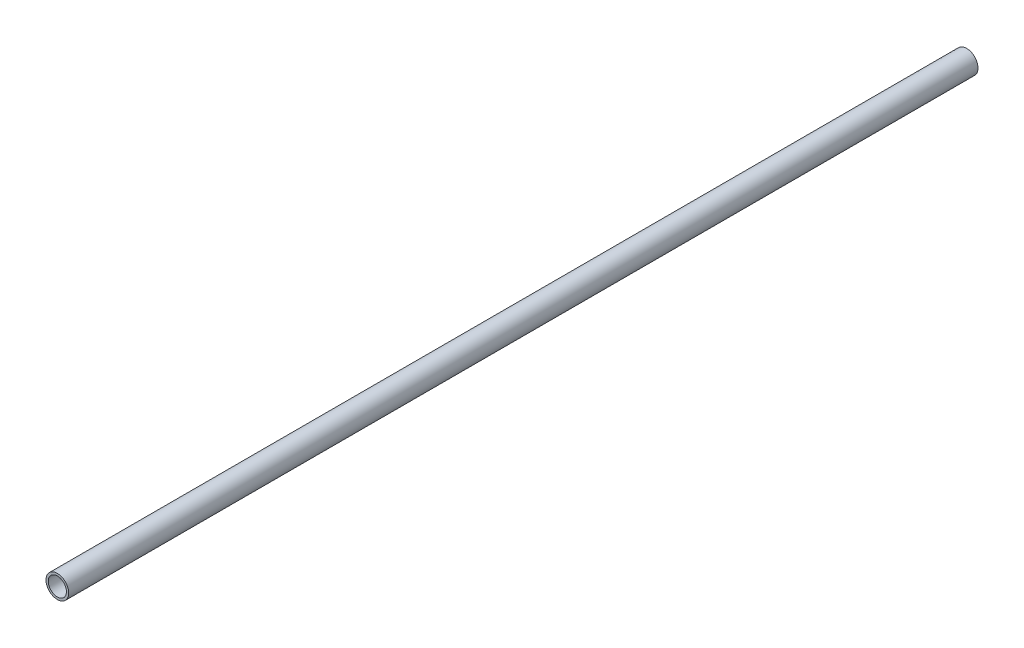
ISO-10303-21;
HEADER;
FILE_DESCRIPTION(('STEP AP214'),'2;1');
FILE_NAME('part.step','',(''),(''),'','','');
FILE_SCHEMA(('AUTOMOTIVE_DESIGN { 1 0 10303 214 1 1 1 1 }'));
ENDSEC;
DATA;
#1=APPLICATION_CONTEXT('core data for automotive mechanical design processes');
#2=APPLICATION_PROTOCOL_DEFINITION('international standard','automotive_design',2000,#1);
#3=PRODUCT_CONTEXT('',#1,'mechanical');
#4=PRODUCT('Part','Part','',(#3));
#5=PRODUCT_RELATED_PRODUCT_CATEGORY('part','',(#4));
#6=PRODUCT_DEFINITION_FORMATION('','',#4);
#7=PRODUCT_DEFINITION_CONTEXT('part definition',#1,'design');
#8=PRODUCT_DEFINITION('design','',#6,#7);
#9=PRODUCT_DEFINITION_SHAPE('','',#8);
#10=(LENGTH_UNIT() NAMED_UNIT(*) SI_UNIT(.MILLI.,.METRE.));
#11=(NAMED_UNIT(*) PLANE_ANGLE_UNIT() SI_UNIT($,.RADIAN.));
#12=(NAMED_UNIT(*) SI_UNIT($,.STERADIAN.) SOLID_ANGLE_UNIT());
#13=UNCERTAINTY_MEASURE_WITH_UNIT(LENGTH_MEASURE(1.E-05),#10,'distance_accuracy_value','');
#14=(GEOMETRIC_REPRESENTATION_CONTEXT(3) GLOBAL_UNCERTAINTY_ASSIGNED_CONTEXT((#13)) GLOBAL_UNIT_ASSIGNED_CONTEXT((#10,
#11,#12)) REPRESENTATION_CONTEXT('',''));
#15=CARTESIAN_POINT('',(0.,0.,0.));
#16=DIRECTION('',(0.,0.,1.));
#17=DIRECTION('',(1.,0.,0.));
#18=AXIS2_PLACEMENT_3D('',#15,#16,#17);
#19=CARTESIAN_POINT('',(0.,0.,400.));
#20=DIRECTION('',(0.,0.,1.));
#21=DIRECTION('',(1.,0.,0.));
#22=AXIS2_PLACEMENT_3D('',#19,#20,#21);
#23=PLANE('',#22);
#24=CARTESIAN_POINT('',(0.,0.,400.));
#25=DIRECTION('',(0.,0.,1.));
#26=DIRECTION('',(1.,0.,0.));
#27=AXIS2_PLACEMENT_3D('',#24,#25,#26);
#28=CIRCLE('',#27,5.);
#29=CARTESIAN_POINT('',(5.,0.,400.));
#30=VERTEX_POINT('',#29);
#31=EDGE_CURVE('E10',#30,#30,#28,.T.);
#32=ORIENTED_EDGE('',*,*,#31,.T.);
#33=EDGE_LOOP('',(#32));
#34=FACE_BOUND('',#33,.T.);
#35=CARTESIAN_POINT('',(0.,0.,400.));
#36=DIRECTION('',(0.,0.,1.));
#37=DIRECTION('',(1.,0.,0.));
#38=AXIS2_PLACEMENT_3D('',#35,#36,#37);
#39=CIRCLE('',#38,4.);
#40=CARTESIAN_POINT('',(4.,0.,400.));
#41=VERTEX_POINT('',#40);
#42=EDGE_CURVE('E50',#41,#41,#39,.T.);
#43=ORIENTED_EDGE('',*,*,#42,.F.);
#44=EDGE_LOOP('',(#43));
#45=FACE_BOUND('',#44,.T.);
#46=ADVANCED_FACE('F39',(#34,#45),#23,.T.);
#47=CARTESIAN_POINT('',(0.,0.,0.));
#48=DIRECTION('',(0.,0.,1.));
#49=DIRECTION('',(1.,0.,0.));
#50=AXIS2_PLACEMENT_3D('',#47,#48,#49);
#51=PLANE('',#50);
#52=CARTESIAN_POINT('',(0.,0.,0.));
#53=DIRECTION('',(0.,0.,1.));
#54=DIRECTION('',(1.,0.,0.));
#55=AXIS2_PLACEMENT_3D('',#52,#53,#54);
#56=CIRCLE('',#55,5.);
#57=CARTESIAN_POINT('',(5.,0.,0.));
#58=VERTEX_POINT('',#57);
#59=EDGE_CURVE('E43',#58,#58,#56,.T.);
#60=ORIENTED_EDGE('',*,*,#59,.F.);
#61=EDGE_LOOP('',(#60));
#62=FACE_BOUND('',#61,.T.);
#63=CARTESIAN_POINT('',(0.,0.,0.));
#64=DIRECTION('',(0.,0.,1.));
#65=DIRECTION('',(1.,0.,0.));
#66=AXIS2_PLACEMENT_3D('',#63,#64,#65);
#67=CIRCLE('',#66,4.);
#68=CARTESIAN_POINT('',(4.,0.,0.));
#69=VERTEX_POINT('',#68);
#70=EDGE_CURVE('E52',#69,#69,#67,.T.);
#71=ORIENTED_EDGE('',*,*,#70,.T.);
#72=EDGE_LOOP('',(#71));
#73=FACE_BOUND('',#72,.T.);
#74=ADVANCED_FACE('F62',(#62,#73),#51,.F.);
#75=CARTESIAN_POINT('',(0.,0.,400.));
#76=DIRECTION('',(0.,0.,-1.));
#77=DIRECTION('',(-1.,0.,0.));
#78=AXIS2_PLACEMENT_3D('',#75,#76,#77);
#79=CYLINDRICAL_SURFACE('',#78,5.);
#80=ORIENTED_EDGE('',*,*,#31,.F.);
#81=EDGE_LOOP('',(#80));
#82=FACE_BOUND('',#81,.T.);
#83=ORIENTED_EDGE('',*,*,#59,.T.);
#84=EDGE_LOOP('',(#83));
#85=FACE_BOUND('',#84,.T.);
#86=ADVANCED_FACE('F41',(#82,#85),#79,.T.);
#87=CARTESIAN_POINT('',(0.,0.,400.));
#88=DIRECTION('',(0.,0.,-1.));
#89=DIRECTION('',(-1.,0.,0.));
#90=AXIS2_PLACEMENT_3D('',#87,#88,#89);
#91=CYLINDRICAL_SURFACE('',#90,4.);
#92=ORIENTED_EDGE('',*,*,#42,.T.);
#93=EDGE_LOOP('',(#92));
#94=FACE_BOUND('',#93,.T.);
#95=ORIENTED_EDGE('',*,*,#70,.F.);
#96=EDGE_LOOP('',(#95));
#97=FACE_BOUND('',#96,.T.);
#98=ADVANCED_FACE('F58',(#94,#97),#91,.F.);
#99=CLOSED_SHELL('',(#46,#74,#86,#98));
#100=MANIFOLD_SOLID_BREP('B2',#99);
#101=ADVANCED_BREP_SHAPE_REPRESENTATION('',(#18,#100),#14);
#102=SHAPE_DEFINITION_REPRESENTATION(#9,#101);
ENDSEC;
END-ISO-10303-21;
